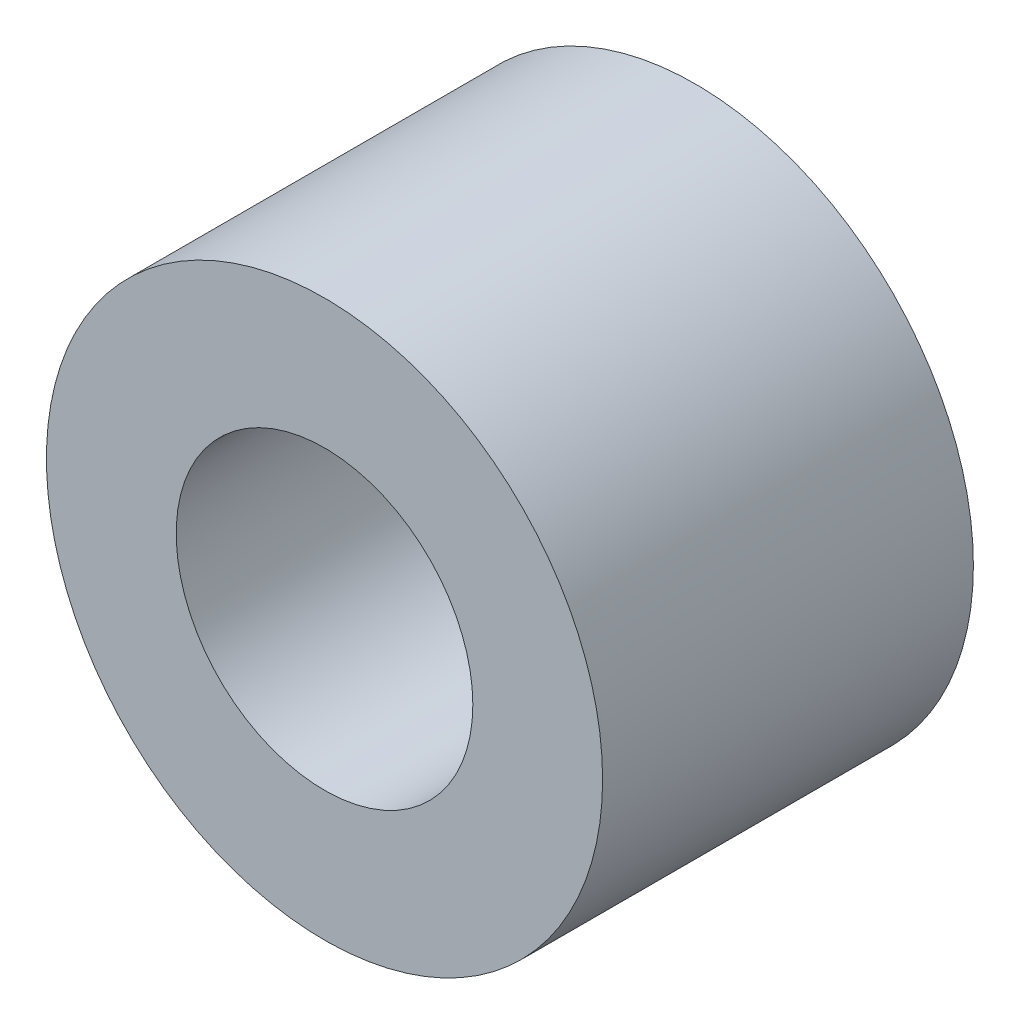
ISO-10303-21;
HEADER;
FILE_DESCRIPTION(('STEP AP214'),'2;1');
FILE_NAME('part.step','',(''),(''),'','','');
FILE_SCHEMA(('AUTOMOTIVE_DESIGN { 1 0 10303 214 1 1 1 1 }'));
ENDSEC;
DATA;
#1=APPLICATION_CONTEXT('core data for automotive mechanical design processes');
#2=APPLICATION_PROTOCOL_DEFINITION('international standard','automotive_design',2000,#1);
#3=PRODUCT_CONTEXT('',#1,'mechanical');
#4=PRODUCT('Part','Part','',(#3));
#5=PRODUCT_RELATED_PRODUCT_CATEGORY('part','',(#4));
#6=PRODUCT_DEFINITION_FORMATION('','',#4);
#7=PRODUCT_DEFINITION_CONTEXT('part definition',#1,'design');
#8=PRODUCT_DEFINITION('design','',#6,#7);
#9=PRODUCT_DEFINITION_SHAPE('','',#8);
#10=(LENGTH_UNIT() NAMED_UNIT(*) SI_UNIT(.MILLI.,.METRE.));
#11=(NAMED_UNIT(*) PLANE_ANGLE_UNIT() SI_UNIT($,.RADIAN.));
#12=(NAMED_UNIT(*) SI_UNIT($,.STERADIAN.) SOLID_ANGLE_UNIT());
#13=UNCERTAINTY_MEASURE_WITH_UNIT(LENGTH_MEASURE(1.E-05),#10,'distance_accuracy_value','');
#14=(GEOMETRIC_REPRESENTATION_CONTEXT(3) GLOBAL_UNCERTAINTY_ASSIGNED_CONTEXT((#13)) GLOBAL_UNIT_ASSIGNED_CONTEXT((#10,
#11,#12)) REPRESENTATION_CONTEXT('',''));
#15=CARTESIAN_POINT('',(0.,0.,0.));
#16=DIRECTION('',(0.,0.,1.));
#17=DIRECTION('',(1.,0.,0.));
#18=AXIS2_PLACEMENT_3D('',#15,#16,#17);
#19=CARTESIAN_POINT('',(0.,0.,-4.));
#20=DIRECTION('',(0.,0.,-1.));
#21=DIRECTION('',(1.,0.,0.));
#22=AXIS2_PLACEMENT_3D('',#19,#20,#21);
#23=PLANE('',#22);
#24=CARTESIAN_POINT('',(0.,0.,-4.));
#25=DIRECTION('',(0.,0.,1.));
#26=DIRECTION('',(1.,0.,0.));
#27=AXIS2_PLACEMENT_3D('',#24,#25,#26);
#28=CIRCLE('',#27,3.);
#29=CARTESIAN_POINT('',(3.,0.,-4.));
#30=VERTEX_POINT('',#29);
#31=EDGE_CURVE('E10',#30,#30,#28,.T.);
#32=ORIENTED_EDGE('',*,*,#31,.F.);
#33=EDGE_LOOP('',(#32));
#34=FACE_BOUND('',#33,.T.);
#35=CARTESIAN_POINT('',(0.,0.,-4.));
#36=DIRECTION('',(0.,0.,1.));
#37=DIRECTION('',(1.,0.,0.));
#38=AXIS2_PLACEMENT_3D('',#35,#36,#37);
#39=CIRCLE('',#38,1.6);
#40=CARTESIAN_POINT('',(1.6,0.,-4.));
#41=VERTEX_POINT('',#40);
#42=EDGE_CURVE('E46',#41,#41,#39,.T.);
#43=ORIENTED_EDGE('',*,*,#42,.T.);
#44=EDGE_LOOP('',(#43));
#45=FACE_BOUND('',#44,.T.);
#46=ADVANCED_FACE('F35',(#34,#45),#23,.T.);
#47=CARTESIAN_POINT('',(0.,0.,0.));
#48=DIRECTION('',(0.,0.,-1.));
#49=DIRECTION('',(1.,0.,0.));
#50=AXIS2_PLACEMENT_3D('',#47,#48,#49);
#51=PLANE('',#50);
#52=CARTESIAN_POINT('',(0.,0.,0.));
#53=DIRECTION('',(0.,0.,1.));
#54=DIRECTION('',(1.,0.,0.));
#55=AXIS2_PLACEMENT_3D('',#52,#53,#54);
#56=CIRCLE('',#55,3.);
#57=CARTESIAN_POINT('',(3.,0.,0.));
#58=VERTEX_POINT('',#57);
#59=EDGE_CURVE('E39',#58,#58,#56,.T.);
#60=ORIENTED_EDGE('',*,*,#59,.T.);
#61=EDGE_LOOP('',(#60));
#62=FACE_BOUND('',#61,.T.);
#63=CARTESIAN_POINT('',(0.,0.,0.));
#64=DIRECTION('',(0.,0.,1.));
#65=DIRECTION('',(1.,0.,0.));
#66=AXIS2_PLACEMENT_3D('',#63,#64,#65);
#67=CIRCLE('',#66,1.6);
#68=CARTESIAN_POINT('',(1.6,0.,0.));
#69=VERTEX_POINT('',#68);
#70=EDGE_CURVE('E48',#69,#69,#67,.T.);
#71=ORIENTED_EDGE('',*,*,#70,.F.);
#72=EDGE_LOOP('',(#71));
#73=FACE_BOUND('',#72,.T.);
#74=ADVANCED_FACE('F61',(#62,#73),#51,.F.);
#75=CARTESIAN_POINT('',(0.,0.,-4.));
#76=DIRECTION('',(0.,0.,1.));
#77=DIRECTION('',(-1.,0.,0.));
#78=AXIS2_PLACEMENT_3D('',#75,#76,#77);
#79=CYLINDRICAL_SURFACE('',#78,3.);
#80=ORIENTED_EDGE('',*,*,#31,.T.);
#81=EDGE_LOOP('',(#80));
#82=FACE_BOUND('',#81,.T.);
#83=ORIENTED_EDGE('',*,*,#59,.F.);
#84=EDGE_LOOP('',(#83));
#85=FACE_BOUND('',#84,.T.);
#86=ADVANCED_FACE('F37',(#82,#85),#79,.T.);
#87=CARTESIAN_POINT('',(0.,0.,-4.));
#88=DIRECTION('',(0.,0.,1.));
#89=DIRECTION('',(-1.,0.,0.));
#90=AXIS2_PLACEMENT_3D('',#87,#88,#89);
#91=CYLINDRICAL_SURFACE('',#90,1.6);
#92=ORIENTED_EDGE('',*,*,#42,.F.);
#93=EDGE_LOOP('',(#92));
#94=FACE_BOUND('',#93,.T.);
#95=ORIENTED_EDGE('',*,*,#70,.T.);
#96=EDGE_LOOP('',(#95));
#97=FACE_BOUND('',#96,.T.);
#98=ADVANCED_FACE('F55',(#94,#97),#91,.F.);
#99=CLOSED_SHELL('',(#46,#74,#86,#98));
#100=MANIFOLD_SOLID_BREP('B2',#99);
#101=ADVANCED_BREP_SHAPE_REPRESENTATION('',(#18,#100),#14);
#102=SHAPE_DEFINITION_REPRESENTATION(#9,#101);
ENDSEC;
END-ISO-10303-21;
